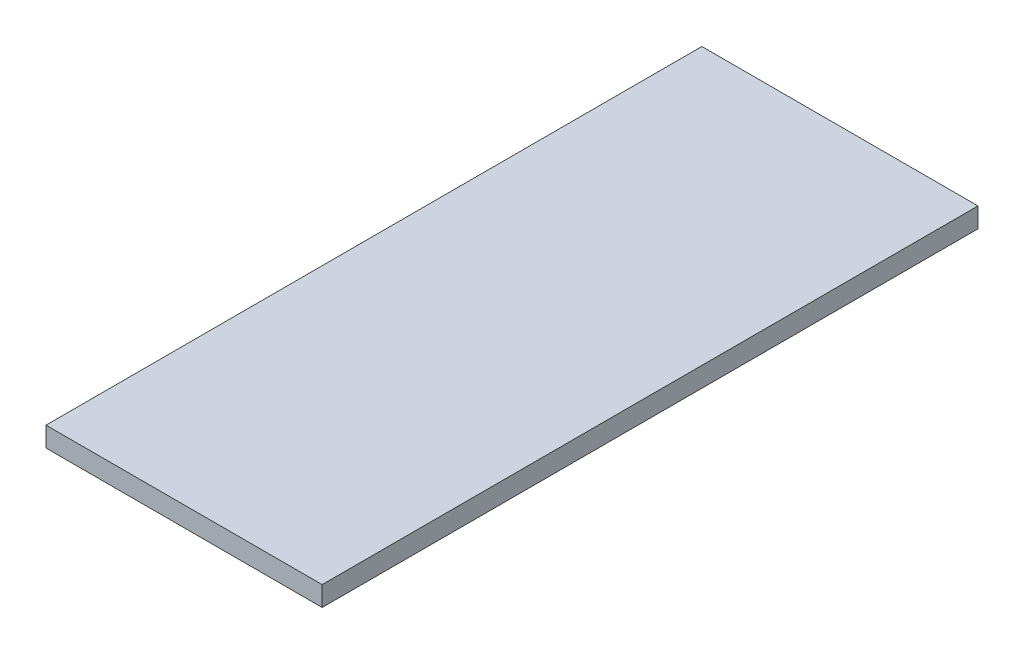
ISO-10303-21;
HEADER;
FILE_DESCRIPTION(('STEP AP214'),'2;1');
FILE_NAME('part.step','',(''),(''),'','','');
FILE_SCHEMA(('AUTOMOTIVE_DESIGN { 1 0 10303 214 1 1 1 1 }'));
ENDSEC;
DATA;
#1=APPLICATION_CONTEXT('core data for automotive mechanical design processes');
#2=APPLICATION_PROTOCOL_DEFINITION('international standard','automotive_design',2000,#1);
#3=PRODUCT_CONTEXT('',#1,'mechanical');
#4=PRODUCT('Part','Part','',(#3));
#5=PRODUCT_RELATED_PRODUCT_CATEGORY('part','',(#4));
#6=PRODUCT_DEFINITION_FORMATION('','',#4);
#7=PRODUCT_DEFINITION_CONTEXT('part definition',#1,'design');
#8=PRODUCT_DEFINITION('design','',#6,#7);
#9=PRODUCT_DEFINITION_SHAPE('','',#8);
#10=(LENGTH_UNIT() NAMED_UNIT(*) SI_UNIT(.MILLI.,.METRE.));
#11=(NAMED_UNIT(*) PLANE_ANGLE_UNIT() SI_UNIT($,.RADIAN.));
#12=(NAMED_UNIT(*) SI_UNIT($,.STERADIAN.) SOLID_ANGLE_UNIT());
#13=UNCERTAINTY_MEASURE_WITH_UNIT(LENGTH_MEASURE(1.E-05),#10,'distance_accuracy_value','');
#14=(GEOMETRIC_REPRESENTATION_CONTEXT(3) GLOBAL_UNCERTAINTY_ASSIGNED_CONTEXT((#13)) GLOBAL_UNIT_ASSIGNED_CONTEXT((#10,
#11,#12)) REPRESENTATION_CONTEXT('',''));
#15=CARTESIAN_POINT('',(0.,0.,0.));
#16=DIRECTION('',(0.,0.,1.));
#17=DIRECTION('',(1.,0.,0.));
#18=AXIS2_PLACEMENT_3D('',#15,#16,#17);
#19=CARTESIAN_POINT('',(-127.,18.25625,0.));
#20=DIRECTION('',(1.,0.,0.));
#21=DIRECTION('',(0.,0.,-1.));
#22=AXIS2_PLACEMENT_3D('',#19,#20,#21);
#23=PLANE('',#22);
#24=DIRECTION('',(0.,0.,1.));
#25=VECTOR('',#24,1.);
#26=CARTESIAN_POINT('',(-127.,0.,0.));
#27=LINE('',#26,#25);
#28=CARTESIAN_POINT('',(-127.,0.,-603.25));
#29=VERTEX_POINT('',#28);
#30=CARTESIAN_POINT('',(-127.,0.,0.));
#31=VERTEX_POINT('',#30);
#32=EDGE_CURVE('E96',#29,#31,#27,.T.);
#33=ORIENTED_EDGE('',*,*,#32,.T.);
#34=DIRECTION('',(0.,-1.,0.));
#35=VECTOR('',#34,1.);
#36=CARTESIAN_POINT('',(-127.,18.25625,0.));
#37=LINE('',#36,#35);
#38=CARTESIAN_POINT('',(-127.,18.25625,0.));
#39=VERTEX_POINT('',#38);
#40=EDGE_CURVE('E11',#39,#31,#37,.T.);
#41=ORIENTED_EDGE('',*,*,#40,.F.);
#42=DIRECTION('',(0.,0.,1.));
#43=VECTOR('',#42,1.);
#44=CARTESIAN_POINT('',(-127.,18.25625,0.));
#45=LINE('',#44,#43);
#46=CARTESIAN_POINT('',(-127.,18.25625,-603.25));
#47=VERTEX_POINT('',#46);
#48=EDGE_CURVE('E84',#47,#39,#45,.T.);
#49=ORIENTED_EDGE('',*,*,#48,.F.);
#50=DIRECTION('',(0.,-1.,0.));
#51=VECTOR('',#50,1.);
#52=CARTESIAN_POINT('',(-127.,18.25625,-603.25));
#53=LINE('',#52,#51);
#54=EDGE_CURVE('E92',#47,#29,#53,.T.);
#55=ORIENTED_EDGE('',*,*,#54,.T.);
#56=EDGE_LOOP('',(#33,#41,#49,#55));
#57=FACE_BOUND('',#56,.T.);
#58=ADVANCED_FACE('F33',(#57),#23,.F.);
#59=CARTESIAN_POINT('',(-127.,18.25625,0.));
#60=DIRECTION('',(0.,0.,-1.));
#61=DIRECTION('',(-1.,0.,0.));
#62=AXIS2_PLACEMENT_3D('',#59,#60,#61);
#63=PLANE('',#62);
#64=DIRECTION('',(1.,0.,0.));
#65=VECTOR('',#64,1.);
#66=CARTESIAN_POINT('',(-127.,0.,0.));
#67=LINE('',#66,#65);
#68=CARTESIAN_POINT('',(127.,0.,0.));
#69=VERTEX_POINT('',#68);
#70=EDGE_CURVE('E88',#31,#69,#67,.T.);
#71=ORIENTED_EDGE('',*,*,#70,.T.);
#72=DIRECTION('',(0.,-1.,0.));
#73=VECTOR('',#72,1.);
#74=CARTESIAN_POINT('',(127.,18.25625,0.));
#75=LINE('',#74,#73);
#76=CARTESIAN_POINT('',(127.,18.25625,0.));
#77=VERTEX_POINT('',#76);
#78=EDGE_CURVE('E41',#77,#69,#75,.T.);
#79=ORIENTED_EDGE('',*,*,#78,.F.);
#80=DIRECTION('',(1.,0.,0.));
#81=VECTOR('',#80,1.);
#82=CARTESIAN_POINT('',(-127.,18.25625,0.));
#83=LINE('',#82,#81);
#84=EDGE_CURVE('E79',#39,#77,#83,.T.);
#85=ORIENTED_EDGE('',*,*,#84,.F.);
#86=ORIENTED_EDGE('',*,*,#40,.T.);
#87=EDGE_LOOP('',(#71,#79,#85,#86));
#88=FACE_BOUND('',#87,.T.);
#89=ADVANCED_FACE('F87',(#88),#63,.F.);
#90=CARTESIAN_POINT('',(127.,18.25625,0.));
#91=DIRECTION('',(-1.,0.,0.));
#92=DIRECTION('',(0.,0.,1.));
#93=AXIS2_PLACEMENT_3D('',#90,#91,#92);
#94=PLANE('',#93);
#95=DIRECTION('',(0.,0.,-1.));
#96=VECTOR('',#95,1.);
#97=CARTESIAN_POINT('',(127.,0.,0.));
#98=LINE('',#97,#96);
#99=CARTESIAN_POINT('',(127.,0.,-603.25));
#100=VERTEX_POINT('',#99);
#101=EDGE_CURVE('E66',#69,#100,#98,.T.);
#102=ORIENTED_EDGE('',*,*,#101,.T.);
#103=DIRECTION('',(0.,-1.,0.));
#104=VECTOR('',#103,1.);
#105=CARTESIAN_POINT('',(127.,18.25625,-603.25));
#106=LINE('',#105,#104);
#107=CARTESIAN_POINT('',(127.,18.25625,-603.25));
#108=VERTEX_POINT('',#107);
#109=EDGE_CURVE('E89',#108,#100,#106,.T.);
#110=ORIENTED_EDGE('',*,*,#109,.F.);
#111=DIRECTION('',(0.,0.,-1.));
#112=VECTOR('',#111,1.);
#113=CARTESIAN_POINT('',(127.,18.25625,0.));
#114=LINE('',#113,#112);
#115=EDGE_CURVE('E82',#77,#108,#114,.T.);
#116=ORIENTED_EDGE('',*,*,#115,.F.);
#117=ORIENTED_EDGE('',*,*,#78,.T.);
#118=EDGE_LOOP('',(#102,#110,#116,#117));
#119=FACE_BOUND('',#118,.T.);
#120=ADVANCED_FACE('F90',(#119),#94,.F.);
#121=CARTESIAN_POINT('',(-127.,18.25625,-603.25));
#122=DIRECTION('',(0.,0.,1.));
#123=DIRECTION('',(1.,0.,0.));
#124=AXIS2_PLACEMENT_3D('',#121,#122,#123);
#125=PLANE('',#124);
#126=DIRECTION('',(-1.,0.,0.));
#127=VECTOR('',#126,1.);
#128=CARTESIAN_POINT('',(-127.,0.,-603.25));
#129=LINE('',#128,#127);
#130=EDGE_CURVE('E72',#100,#29,#129,.T.);
#131=ORIENTED_EDGE('',*,*,#130,.T.);
#132=ORIENTED_EDGE('',*,*,#54,.F.);
#133=DIRECTION('',(-1.,0.,0.));
#134=VECTOR('',#133,1.);
#135=CARTESIAN_POINT('',(-127.,18.25625,-603.25));
#136=LINE('',#135,#134);
#137=EDGE_CURVE('E49',#108,#47,#136,.T.);
#138=ORIENTED_EDGE('',*,*,#137,.F.);
#139=ORIENTED_EDGE('',*,*,#109,.T.);
#140=EDGE_LOOP('',(#131,#132,#138,#139));
#141=FACE_BOUND('',#140,.T.);
#142=ADVANCED_FACE('F103',(#141),#125,.F.);
#143=CARTESIAN_POINT('',(0.,18.25625,0.));
#144=DIRECTION('',(0.,-1.,0.));
#145=DIRECTION('',(0.,0.,-1.));
#146=AXIS2_PLACEMENT_3D('',#143,#144,#145);
#147=PLANE('',#146);
#148=ORIENTED_EDGE('',*,*,#48,.T.);
#149=ORIENTED_EDGE('',*,*,#84,.T.);
#150=ORIENTED_EDGE('',*,*,#115,.T.);
#151=ORIENTED_EDGE('',*,*,#137,.T.);
#152=EDGE_LOOP('',(#148,#149,#150,#151));
#153=FACE_BOUND('',#152,.T.);
#154=ADVANCED_FACE('F80',(#153),#147,.F.);
#155=CARTESIAN_POINT('',(0.,0.,0.));
#156=DIRECTION('',(0.,-1.,0.));
#157=DIRECTION('',(0.,0.,-1.));
#158=AXIS2_PLACEMENT_3D('',#155,#156,#157);
#159=PLANE('',#158);
#160=ORIENTED_EDGE('',*,*,#32,.F.);
#161=ORIENTED_EDGE('',*,*,#130,.F.);
#162=ORIENTED_EDGE('',*,*,#101,.F.);
#163=ORIENTED_EDGE('',*,*,#70,.F.);
#164=EDGE_LOOP('',(#160,#161,#162,#163));
#165=FACE_BOUND('',#164,.T.);
#166=ADVANCED_FACE('F106',(#165),#159,.T.);
#167=CLOSED_SHELL('',(#58,#89,#120,#142,#154,#166));
#168=MANIFOLD_SOLID_BREP('B2',#167);
#169=ADVANCED_BREP_SHAPE_REPRESENTATION('',(#18,#168),#14);
#170=SHAPE_DEFINITION_REPRESENTATION(#9,#169);
ENDSEC;
END-ISO-10303-21;
